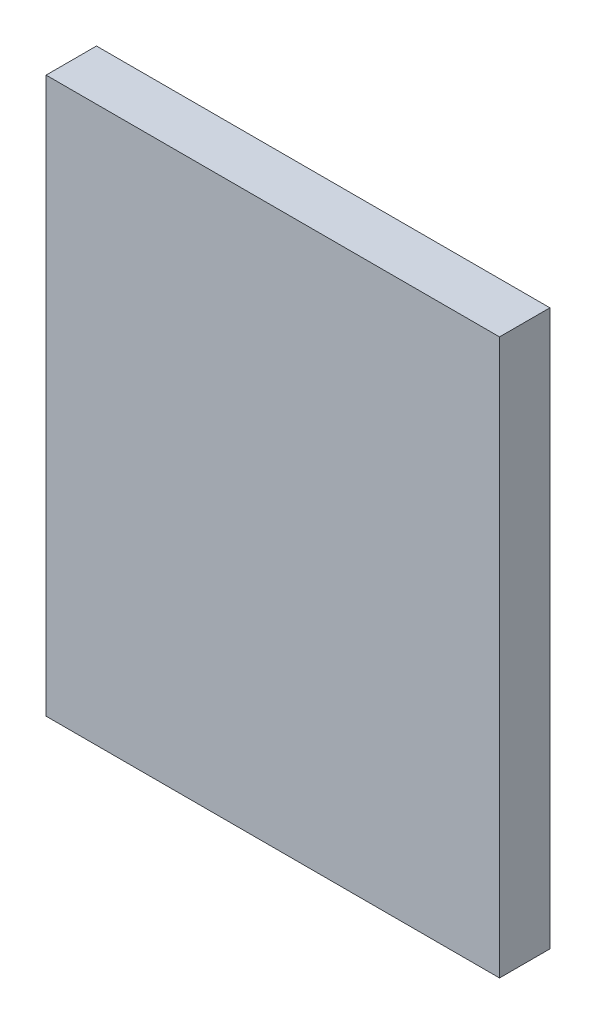
ISO-10303-21;
HEADER;
FILE_DESCRIPTION(('STEP AP214'),'2;1');
FILE_NAME('part.step','',(''),(''),'','','');
FILE_SCHEMA(('AUTOMOTIVE_DESIGN { 1 0 10303 214 1 1 1 1 }'));
ENDSEC;
DATA;
#1=APPLICATION_CONTEXT('core data for automotive mechanical design processes');
#2=APPLICATION_PROTOCOL_DEFINITION('international standard','automotive_design',2000,#1);
#3=PRODUCT_CONTEXT('',#1,'mechanical');
#4=PRODUCT('Part','Part','',(#3));
#5=PRODUCT_RELATED_PRODUCT_CATEGORY('part','',(#4));
#6=PRODUCT_DEFINITION_FORMATION('','',#4);
#7=PRODUCT_DEFINITION_CONTEXT('part definition',#1,'design');
#8=PRODUCT_DEFINITION('design','',#6,#7);
#9=PRODUCT_DEFINITION_SHAPE('','',#8);
#10=(LENGTH_UNIT() NAMED_UNIT(*) SI_UNIT(.MILLI.,.METRE.));
#11=(NAMED_UNIT(*) PLANE_ANGLE_UNIT() SI_UNIT($,.RADIAN.));
#12=(NAMED_UNIT(*) SI_UNIT($,.STERADIAN.) SOLID_ANGLE_UNIT());
#13=UNCERTAINTY_MEASURE_WITH_UNIT(LENGTH_MEASURE(1.E-05),#10,'distance_accuracy_value','');
#14=(GEOMETRIC_REPRESENTATION_CONTEXT(3) GLOBAL_UNCERTAINTY_ASSIGNED_CONTEXT((#13)) GLOBAL_UNIT_ASSIGNED_CONTEXT((#10,
#11,#12)) REPRESENTATION_CONTEXT('',''));
#15=CARTESIAN_POINT('',(0.,0.,0.));
#16=DIRECTION('',(0.,0.,1.));
#17=DIRECTION('',(1.,0.,0.));
#18=AXIS2_PLACEMENT_3D('',#15,#16,#17);
#19=CARTESIAN_POINT('',(0.,0.,12.7));
#20=DIRECTION('',(1.,0.,0.));
#21=DIRECTION('',(0.,1.,0.));
#22=AXIS2_PLACEMENT_3D('',#19,#20,#21);
#23=PLANE('',#22);
#24=DIRECTION('',(0.,-1.,0.));
#25=VECTOR('',#24,1.);
#26=CARTESIAN_POINT('',(0.,0.,-12.7));
#27=LINE('',#26,#25);
#28=CARTESIAN_POINT('',(0.,279.908,-12.7));
#29=VERTEX_POINT('',#28);
#30=CARTESIAN_POINT('',(0.,0.,-12.7));
#31=VERTEX_POINT('',#30);
#32=EDGE_CURVE('E96',#29,#31,#27,.T.);
#33=ORIENTED_EDGE('',*,*,#32,.T.);
#34=DIRECTION('',(0.,0.,-1.));
#35=VECTOR('',#34,1.);
#36=CARTESIAN_POINT('',(0.,0.,12.7));
#37=LINE('',#36,#35);
#38=CARTESIAN_POINT('',(0.,0.,12.7));
#39=VERTEX_POINT('',#38);
#40=EDGE_CURVE('E11',#39,#31,#37,.T.);
#41=ORIENTED_EDGE('',*,*,#40,.F.);
#42=DIRECTION('',(0.,-1.,0.));
#43=VECTOR('',#42,1.);
#44=CARTESIAN_POINT('',(0.,0.,12.7));
#45=LINE('',#44,#43);
#46=CARTESIAN_POINT('',(0.,279.908,12.7));
#47=VERTEX_POINT('',#46);
#48=EDGE_CURVE('E84',#47,#39,#45,.T.);
#49=ORIENTED_EDGE('',*,*,#48,.F.);
#50=DIRECTION('',(0.,0.,-1.));
#51=VECTOR('',#50,1.);
#52=CARTESIAN_POINT('',(0.,279.908,12.7));
#53=LINE('',#52,#51);
#54=EDGE_CURVE('E92',#47,#29,#53,.T.);
#55=ORIENTED_EDGE('',*,*,#54,.T.);
#56=EDGE_LOOP('',(#33,#41,#49,#55));
#57=FACE_BOUND('',#56,.T.);
#58=ADVANCED_FACE('F33',(#57),#23,.F.);
#59=CARTESIAN_POINT('',(0.,0.,12.7));
#60=DIRECTION('',(0.,1.,0.));
#61=DIRECTION('',(0.,0.,1.));
#62=AXIS2_PLACEMENT_3D('',#59,#60,#61);
#63=PLANE('',#62);
#64=DIRECTION('',(1.,0.,0.));
#65=VECTOR('',#64,1.);
#66=CARTESIAN_POINT('',(0.,0.,-12.7));
#67=LINE('',#66,#65);
#68=CARTESIAN_POINT('',(228.6,0.,-12.7));
#69=VERTEX_POINT('',#68);
#70=EDGE_CURVE('E88',#31,#69,#67,.T.);
#71=ORIENTED_EDGE('',*,*,#70,.T.);
#72=DIRECTION('',(0.,0.,-1.));
#73=VECTOR('',#72,1.);
#74=CARTESIAN_POINT('',(228.6,0.,12.7));
#75=LINE('',#74,#73);
#76=CARTESIAN_POINT('',(228.6,0.,12.7));
#77=VERTEX_POINT('',#76);
#78=EDGE_CURVE('E41',#77,#69,#75,.T.);
#79=ORIENTED_EDGE('',*,*,#78,.F.);
#80=DIRECTION('',(1.,0.,0.));
#81=VECTOR('',#80,1.);
#82=CARTESIAN_POINT('',(0.,0.,12.7));
#83=LINE('',#82,#81);
#84=EDGE_CURVE('E79',#39,#77,#83,.T.);
#85=ORIENTED_EDGE('',*,*,#84,.F.);
#86=ORIENTED_EDGE('',*,*,#40,.T.);
#87=EDGE_LOOP('',(#71,#79,#85,#86));
#88=FACE_BOUND('',#87,.T.);
#89=ADVANCED_FACE('F87',(#88),#63,.F.);
#90=CARTESIAN_POINT('',(228.6,0.,12.7));
#91=DIRECTION('',(-1.,0.,0.));
#92=DIRECTION('',(0.,-1.,0.));
#93=AXIS2_PLACEMENT_3D('',#90,#91,#92);
#94=PLANE('',#93);
#95=DIRECTION('',(0.,1.,0.));
#96=VECTOR('',#95,1.);
#97=CARTESIAN_POINT('',(228.6,0.,-12.7));
#98=LINE('',#97,#96);
#99=CARTESIAN_POINT('',(228.6,279.908,-12.7));
#100=VERTEX_POINT('',#99);
#101=EDGE_CURVE('E66',#69,#100,#98,.T.);
#102=ORIENTED_EDGE('',*,*,#101,.T.);
#103=DIRECTION('',(0.,0.,-1.));
#104=VECTOR('',#103,1.);
#105=CARTESIAN_POINT('',(228.6,279.908,12.7));
#106=LINE('',#105,#104);
#107=CARTESIAN_POINT('',(228.6,279.908,12.7));
#108=VERTEX_POINT('',#107);
#109=EDGE_CURVE('E89',#108,#100,#106,.T.);
#110=ORIENTED_EDGE('',*,*,#109,.F.);
#111=DIRECTION('',(0.,1.,0.));
#112=VECTOR('',#111,1.);
#113=CARTESIAN_POINT('',(228.6,0.,12.7));
#114=LINE('',#113,#112);
#115=EDGE_CURVE('E82',#77,#108,#114,.T.);
#116=ORIENTED_EDGE('',*,*,#115,.F.);
#117=ORIENTED_EDGE('',*,*,#78,.T.);
#118=EDGE_LOOP('',(#102,#110,#116,#117));
#119=FACE_BOUND('',#118,.T.);
#120=ADVANCED_FACE('F90',(#119),#94,.F.);
#121=CARTESIAN_POINT('',(0.,279.908,12.7));
#122=DIRECTION('',(0.,-1.,0.));
#123=DIRECTION('',(0.,0.,-1.));
#124=AXIS2_PLACEMENT_3D('',#121,#122,#123);
#125=PLANE('',#124);
#126=DIRECTION('',(-1.,0.,0.));
#127=VECTOR('',#126,1.);
#128=CARTESIAN_POINT('',(0.,279.908,-12.7));
#129=LINE('',#128,#127);
#130=EDGE_CURVE('E72',#100,#29,#129,.T.);
#131=ORIENTED_EDGE('',*,*,#130,.T.);
#132=ORIENTED_EDGE('',*,*,#54,.F.);
#133=DIRECTION('',(-1.,0.,0.));
#134=VECTOR('',#133,1.);
#135=CARTESIAN_POINT('',(0.,279.908,12.7));
#136=LINE('',#135,#134);
#137=EDGE_CURVE('E49',#108,#47,#136,.T.);
#138=ORIENTED_EDGE('',*,*,#137,.F.);
#139=ORIENTED_EDGE('',*,*,#109,.T.);
#140=EDGE_LOOP('',(#131,#132,#138,#139));
#141=FACE_BOUND('',#140,.T.);
#142=ADVANCED_FACE('F103',(#141),#125,.F.);
#143=CARTESIAN_POINT('',(0.,0.,12.7));
#144=DIRECTION('',(0.,0.,-1.));
#145=DIRECTION('',(-1.,0.,0.));
#146=AXIS2_PLACEMENT_3D('',#143,#144,#145);
#147=PLANE('',#146);
#148=ORIENTED_EDGE('',*,*,#48,.T.);
#149=ORIENTED_EDGE('',*,*,#84,.T.);
#150=ORIENTED_EDGE('',*,*,#115,.T.);
#151=ORIENTED_EDGE('',*,*,#137,.T.);
#152=EDGE_LOOP('',(#148,#149,#150,#151));
#153=FACE_BOUND('',#152,.T.);
#154=ADVANCED_FACE('F80',(#153),#147,.F.);
#155=CARTESIAN_POINT('',(0.,0.,-12.7));
#156=DIRECTION('',(0.,0.,-1.));
#157=DIRECTION('',(-1.,0.,0.));
#158=AXIS2_PLACEMENT_3D('',#155,#156,#157);
#159=PLANE('',#158);
#160=ORIENTED_EDGE('',*,*,#32,.F.);
#161=ORIENTED_EDGE('',*,*,#130,.F.);
#162=ORIENTED_EDGE('',*,*,#101,.F.);
#163=ORIENTED_EDGE('',*,*,#70,.F.);
#164=EDGE_LOOP('',(#160,#161,#162,#163));
#165=FACE_BOUND('',#164,.T.);
#166=ADVANCED_FACE('F106',(#165),#159,.T.);
#167=CLOSED_SHELL('',(#58,#89,#120,#142,#154,#166));
#168=MANIFOLD_SOLID_BREP('B2',#167);
#169=ADVANCED_BREP_SHAPE_REPRESENTATION('',(#18,#168),#14);
#170=SHAPE_DEFINITION_REPRESENTATION(#9,#169);
ENDSEC;
END-ISO-10303-21;
